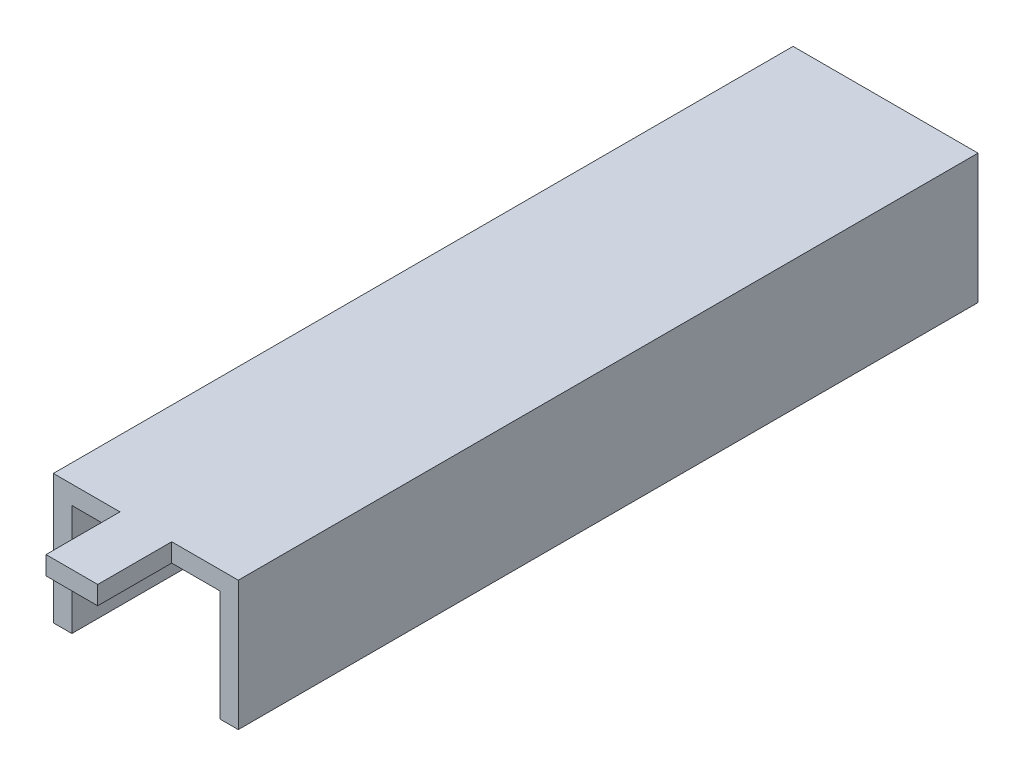
ISO-10303-21;
HEADER;
FILE_DESCRIPTION(('STEP AP214'),'2;1');
FILE_NAME('part.step','',(''),(''),'','','');
FILE_SCHEMA(('AUTOMOTIVE_DESIGN { 1 0 10303 214 1 1 1 1 }'));
ENDSEC;
DATA;
#1=APPLICATION_CONTEXT('core data for automotive mechanical design processes');
#2=APPLICATION_PROTOCOL_DEFINITION('international standard','automotive_design',2000,#1);
#3=PRODUCT_CONTEXT('',#1,'mechanical');
#4=PRODUCT('Part','Part','',(#3));
#5=PRODUCT_RELATED_PRODUCT_CATEGORY('part','',(#4));
#6=PRODUCT_DEFINITION_FORMATION('','',#4);
#7=PRODUCT_DEFINITION_CONTEXT('part definition',#1,'design');
#8=PRODUCT_DEFINITION('design','',#6,#7);
#9=PRODUCT_DEFINITION_SHAPE('','',#8);
#10=(LENGTH_UNIT() NAMED_UNIT(*) SI_UNIT(.MILLI.,.METRE.));
#11=(NAMED_UNIT(*) PLANE_ANGLE_UNIT() SI_UNIT($,.RADIAN.));
#12=(NAMED_UNIT(*) SI_UNIT($,.STERADIAN.) SOLID_ANGLE_UNIT());
#13=UNCERTAINTY_MEASURE_WITH_UNIT(LENGTH_MEASURE(1.E-05),#10,'distance_accuracy_value','');
#14=(GEOMETRIC_REPRESENTATION_CONTEXT(3) GLOBAL_UNCERTAINTY_ASSIGNED_CONTEXT((#13)) GLOBAL_UNIT_ASSIGNED_CONTEXT((#10,
#11,#12)) REPRESENTATION_CONTEXT('',''));
#15=CARTESIAN_POINT('',(0.,0.,0.));
#16=DIRECTION('',(0.,0.,1.));
#17=DIRECTION('',(1.,0.,0.));
#18=AXIS2_PLACEMENT_3D('',#15,#16,#17);
#19=CARTESIAN_POINT('',(0.,0.,254.));
#20=DIRECTION('',(0.,0.,-1.));
#21=DIRECTION('',(-1.,0.,0.));
#22=AXIS2_PLACEMENT_3D('',#19,#20,#21);
#23=PLANE('',#22);
#24=DIRECTION('',(0.,-1.,0.));
#25=VECTOR('',#24,1.);
#26=CARTESIAN_POINT('',(22.8703532456134,38.1,254.));
#27=LINE('',#26,#25);
#28=CARTESIAN_POINT('',(22.8703532456134,44.45,254.));
#29=VERTEX_POINT('',#28);
#30=CARTESIAN_POINT('',(22.8703532456134,38.1,254.));
#31=VERTEX_POINT('',#30);
#32=EDGE_CURVE('E49',#29,#31,#27,.T.);
#33=ORIENTED_EDGE('',*,*,#32,.F.);
#34=DIRECTION('',(-1.,0.,0.));
#35=VECTOR('',#34,1.);
#36=CARTESIAN_POINT('',(57.15,44.45,254.));
#37=LINE('',#36,#35);
#38=CARTESIAN_POINT('',(0.,44.45,254.));
#39=VERTEX_POINT('',#38);
#40=EDGE_CURVE('E171',#29,#39,#37,.T.);
#41=ORIENTED_EDGE('',*,*,#40,.T.);
#42=DIRECTION('',(0.,-1.,0.));
#43=VECTOR('',#42,1.);
#44=CARTESIAN_POINT('',(0.,0.,254.));
#45=LINE('',#44,#43);
#46=CARTESIAN_POINT('',(0.,0.,254.));
#47=VERTEX_POINT('',#46);
#48=EDGE_CURVE('E154',#39,#47,#45,.T.);
#49=ORIENTED_EDGE('',*,*,#48,.T.);
#50=DIRECTION('',(1.,0.,0.));
#51=VECTOR('',#50,1.);
#52=CARTESIAN_POINT('',(0.,0.,254.));
#53=LINE('',#52,#51);
#54=CARTESIAN_POINT('',(6.35,0.,254.));
#55=VERTEX_POINT('',#54);
#56=EDGE_CURVE('E157',#47,#55,#53,.T.);
#57=ORIENTED_EDGE('',*,*,#56,.T.);
#58=DIRECTION('',(0.,1.,0.));
#59=VECTOR('',#58,1.);
#60=CARTESIAN_POINT('',(6.35,0.,254.));
#61=LINE('',#60,#59);
#62=CARTESIAN_POINT('',(6.35,38.1,254.));
#63=VERTEX_POINT('',#62);
#64=EDGE_CURVE('E160',#55,#63,#61,.T.);
#65=ORIENTED_EDGE('',*,*,#64,.T.);
#66=DIRECTION('',(1.,0.,0.));
#67=VECTOR('',#66,1.);
#68=CARTESIAN_POINT('',(6.35,38.1,254.));
#69=LINE('',#68,#67);
#70=EDGE_CURVE('E163',#63,#31,#69,.T.);
#71=ORIENTED_EDGE('',*,*,#70,.T.);
#72=EDGE_LOOP('',(#33,#41,#49,#57,#65,#71));
#73=FACE_BOUND('',#72,.T.);
#74=ADVANCED_FACE('F34',(#73),#23,.F.);
#75=DIRECTION('',(0.,1.,0.));
#76=VECTOR('',#75,1.);
#77=CARTESIAN_POINT('',(40.6296467543866,38.1,254.));
#78=LINE('',#77,#76);
#79=CARTESIAN_POINT('',(40.6296467543866,38.1,254.));
#80=VERTEX_POINT('',#79);
#81=CARTESIAN_POINT('',(40.6296467543866,44.45,254.));
#82=VERTEX_POINT('',#81);
#83=EDGE_CURVE('E57',#80,#82,#78,.T.);
#84=ORIENTED_EDGE('',*,*,#83,.F.);
#85=CARTESIAN_POINT('',(57.15,38.1,254.));
#86=VERTEX_POINT('',#85);
#87=EDGE_CURVE('E162',#80,#86,#69,.T.);
#88=ORIENTED_EDGE('',*,*,#87,.T.);
#89=DIRECTION('',(0.,-1.,0.));
#90=VECTOR('',#89,1.);
#91=CARTESIAN_POINT('',(57.15,38.1,254.));
#92=LINE('',#91,#90);
#93=CARTESIAN_POINT('',(57.15,0.,254.));
#94=VERTEX_POINT('',#93);
#95=EDGE_CURVE('E165',#86,#94,#92,.T.);
#96=ORIENTED_EDGE('',*,*,#95,.T.);
#97=DIRECTION('',(1.,0.,0.));
#98=VECTOR('',#97,1.);
#99=CARTESIAN_POINT('',(57.15,0.,254.));
#100=LINE('',#99,#98);
#101=CARTESIAN_POINT('',(63.5,0.,254.));
#102=VERTEX_POINT('',#101);
#103=EDGE_CURVE('E167',#94,#102,#100,.T.);
#104=ORIENTED_EDGE('',*,*,#103,.T.);
#105=DIRECTION('',(0.,1.,0.));
#106=VECTOR('',#105,1.);
#107=CARTESIAN_POINT('',(63.5,44.45,254.));
#108=LINE('',#107,#106);
#109=CARTESIAN_POINT('',(63.5,44.45,254.));
#110=VERTEX_POINT('',#109);
#111=EDGE_CURVE('E169',#102,#110,#108,.T.);
#112=ORIENTED_EDGE('',*,*,#111,.T.);
#113=EDGE_CURVE('E172',#110,#82,#37,.T.);
#114=ORIENTED_EDGE('',*,*,#113,.T.);
#115=EDGE_LOOP('',(#84,#88,#96,#104,#112,#114));
#116=FACE_BOUND('',#115,.T.);
#117=ADVANCED_FACE('F224',(#116),#23,.F.);
#118=CARTESIAN_POINT('',(0.,0.,254.));
#119=DIRECTION('',(1.,0.,0.));
#120=DIRECTION('',(0.,0.,-1.));
#121=AXIS2_PLACEMENT_3D('',#118,#119,#120);
#122=PLANE('',#121);
#123=DIRECTION('',(0.,-1.,0.));
#124=VECTOR('',#123,1.);
#125=CARTESIAN_POINT('',(0.,0.,0.));
#126=LINE('',#125,#124);
#127=CARTESIAN_POINT('',(0.,44.45,0.));
#128=VERTEX_POINT('',#127);
#129=CARTESIAN_POINT('',(0.,0.,0.));
#130=VERTEX_POINT('',#129);
#131=EDGE_CURVE('E145',#128,#130,#126,.T.);
#132=ORIENTED_EDGE('',*,*,#131,.T.);
#133=DIRECTION('',(0.,0.,-1.));
#134=VECTOR('',#133,1.);
#135=CARTESIAN_POINT('',(0.,0.,254.));
#136=LINE('',#135,#134);
#137=EDGE_CURVE('E11',#47,#130,#136,.T.);
#138=ORIENTED_EDGE('',*,*,#137,.F.);
#139=ORIENTED_EDGE('',*,*,#48,.F.);
#140=DIRECTION('',(0.,0.,-1.));
#141=VECTOR('',#140,1.);
#142=CARTESIAN_POINT('',(0.,44.45,254.));
#143=LINE('',#142,#141);
#144=EDGE_CURVE('E173',#39,#128,#143,.T.);
#145=ORIENTED_EDGE('',*,*,#144,.T.);
#146=EDGE_LOOP('',(#132,#138,#139,#145));
#147=FACE_BOUND('',#146,.T.);
#148=ADVANCED_FACE('F36',(#147),#122,.F.);
#149=CARTESIAN_POINT('',(0.,0.,254.));
#150=DIRECTION('',(0.,1.,0.));
#151=DIRECTION('',(0.,0.,1.));
#152=AXIS2_PLACEMENT_3D('',#149,#150,#151);
#153=PLANE('',#152);
#154=DIRECTION('',(1.,0.,0.));
#155=VECTOR('',#154,1.);
#156=CARTESIAN_POINT('',(0.,0.,0.));
#157=LINE('',#156,#155);
#158=CARTESIAN_POINT('',(6.35,0.,0.));
#159=VERTEX_POINT('',#158);
#160=EDGE_CURVE('E148',#130,#159,#157,.T.);
#161=ORIENTED_EDGE('',*,*,#160,.T.);
#162=DIRECTION('',(0.,0.,-1.));
#163=VECTOR('',#162,1.);
#164=CARTESIAN_POINT('',(6.35,0.,254.));
#165=LINE('',#164,#163);
#166=EDGE_CURVE('E42',#55,#159,#165,.T.);
#167=ORIENTED_EDGE('',*,*,#166,.F.);
#168=ORIENTED_EDGE('',*,*,#56,.F.);
#169=ORIENTED_EDGE('',*,*,#137,.T.);
#170=EDGE_LOOP('',(#161,#167,#168,#169));
#171=FACE_BOUND('',#170,.T.);
#172=ADVANCED_FACE('F243',(#171),#153,.F.);
#173=CARTESIAN_POINT('',(6.35,0.,254.));
#174=DIRECTION('',(-1.,0.,0.));
#175=DIRECTION('',(0.,-1.,0.));
#176=AXIS2_PLACEMENT_3D('',#173,#174,#175);
#177=PLANE('',#176);
#178=DIRECTION('',(0.,1.,0.));
#179=VECTOR('',#178,1.);
#180=CARTESIAN_POINT('',(6.35,0.,0.));
#181=LINE('',#180,#179);
#182=CARTESIAN_POINT('',(6.35,38.1,0.));
#183=VERTEX_POINT('',#182);
#184=EDGE_CURVE('E176',#159,#183,#181,.T.);
#185=ORIENTED_EDGE('',*,*,#184,.T.);
#186=DIRECTION('',(0.,0.,-1.));
#187=VECTOR('',#186,1.);
#188=CARTESIAN_POINT('',(6.35,38.1,254.));
#189=LINE('',#188,#187);
#190=EDGE_CURVE('E202',#63,#183,#189,.T.);
#191=ORIENTED_EDGE('',*,*,#190,.F.);
#192=ORIENTED_EDGE('',*,*,#64,.F.);
#193=ORIENTED_EDGE('',*,*,#166,.T.);
#194=EDGE_LOOP('',(#185,#191,#192,#193));
#195=FACE_BOUND('',#194,.T.);
#196=ADVANCED_FACE('F209',(#195),#177,.F.);
#197=CARTESIAN_POINT('',(6.35,38.1,254.));
#198=DIRECTION('',(0.,1.,0.));
#199=DIRECTION('',(0.,0.,1.));
#200=AXIS2_PLACEMENT_3D('',#197,#198,#199);
#201=PLANE('',#200);
#202=DIRECTION('',(1.,0.,0.));
#203=VECTOR('',#202,1.);
#204=CARTESIAN_POINT('',(6.35,38.1,0.));
#205=LINE('',#204,#203);
#206=CARTESIAN_POINT('',(57.15,38.1,0.));
#207=VERTEX_POINT('',#206);
#208=EDGE_CURVE('E178',#183,#207,#205,.T.);
#209=ORIENTED_EDGE('',*,*,#208,.T.);
#210=DIRECTION('',(0.,0.,-1.));
#211=VECTOR('',#210,1.);
#212=CARTESIAN_POINT('',(57.15,38.1,254.));
#213=LINE('',#212,#211);
#214=EDGE_CURVE('E199',#86,#207,#213,.T.);
#215=ORIENTED_EDGE('',*,*,#214,.F.);
#216=ORIENTED_EDGE('',*,*,#87,.F.);
#217=DIRECTION('',(0.,0.,-1.));
#218=VECTOR('',#217,1.);
#219=CARTESIAN_POINT('',(40.6296467543866,38.1,279.4));
#220=LINE('',#219,#218);
#221=CARTESIAN_POINT('',(40.6296467543866,38.1,279.4));
#222=VERTEX_POINT('',#221);
#223=EDGE_CURVE('E130',#222,#80,#220,.T.);
#224=ORIENTED_EDGE('',*,*,#223,.F.);
#225=DIRECTION('',(1.,0.,0.));
#226=VECTOR('',#225,1.);
#227=CARTESIAN_POINT('',(22.8703532456134,38.1,279.4));
#228=LINE('',#227,#226);
#229=CARTESIAN_POINT('',(22.8703532456134,38.1,279.4));
#230=VERTEX_POINT('',#229);
#231=EDGE_CURVE('E123',#230,#222,#228,.T.);
#232=ORIENTED_EDGE('',*,*,#231,.F.);
#233=DIRECTION('',(0.,0.,-1.));
#234=VECTOR('',#233,1.);
#235=CARTESIAN_POINT('',(22.8703532456134,38.1,279.4));
#236=LINE('',#235,#234);
#237=EDGE_CURVE('E128',#230,#31,#236,.T.);
#238=ORIENTED_EDGE('',*,*,#237,.T.);
#239=ORIENTED_EDGE('',*,*,#70,.F.);
#240=ORIENTED_EDGE('',*,*,#190,.T.);
#241=EDGE_LOOP('',(#209,#215,#216,#224,#232,#238,#239,#240));
#242=FACE_BOUND('',#241,.T.);
#243=ADVANCED_FACE('F125',(#242),#201,.F.);
#244=CARTESIAN_POINT('',(57.15,38.1,254.));
#245=DIRECTION('',(1.,0.,0.));
#246=DIRECTION('',(0.,1.,0.));
#247=AXIS2_PLACEMENT_3D('',#244,#245,#246);
#248=PLANE('',#247);
#249=DIRECTION('',(0.,-1.,0.));
#250=VECTOR('',#249,1.);
#251=CARTESIAN_POINT('',(57.15,38.1,0.));
#252=LINE('',#251,#250);
#253=CARTESIAN_POINT('',(57.15,0.,0.));
#254=VERTEX_POINT('',#253);
#255=EDGE_CURVE('E180',#207,#254,#252,.T.);
#256=ORIENTED_EDGE('',*,*,#255,.T.);
#257=DIRECTION('',(0.,0.,-1.));
#258=VECTOR('',#257,1.);
#259=CARTESIAN_POINT('',(57.15,0.,254.));
#260=LINE('',#259,#258);
#261=EDGE_CURVE('E196',#94,#254,#260,.T.);
#262=ORIENTED_EDGE('',*,*,#261,.F.);
#263=ORIENTED_EDGE('',*,*,#95,.F.);
#264=ORIENTED_EDGE('',*,*,#214,.T.);
#265=EDGE_LOOP('',(#256,#262,#263,#264));
#266=FACE_BOUND('',#265,.T.);
#267=ADVANCED_FACE('F221',(#266),#248,.F.);
#268=CARTESIAN_POINT('',(57.15,0.,254.));
#269=DIRECTION('',(0.,1.,0.));
#270=DIRECTION('',(-1.,0.,0.));
#271=AXIS2_PLACEMENT_3D('',#268,#269,#270);
#272=PLANE('',#271);
#273=DIRECTION('',(1.,0.,0.));
#274=VECTOR('',#273,1.);
#275=CARTESIAN_POINT('',(57.15,0.,0.));
#276=LINE('',#275,#274);
#277=CARTESIAN_POINT('',(63.5,0.,0.));
#278=VERTEX_POINT('',#277);
#279=EDGE_CURVE('E182',#254,#278,#276,.T.);
#280=ORIENTED_EDGE('',*,*,#279,.T.);
#281=DIRECTION('',(0.,0.,-1.));
#282=VECTOR('',#281,1.);
#283=CARTESIAN_POINT('',(63.5,0.,254.));
#284=LINE('',#283,#282);
#285=EDGE_CURVE('E193',#102,#278,#284,.T.);
#286=ORIENTED_EDGE('',*,*,#285,.F.);
#287=ORIENTED_EDGE('',*,*,#103,.F.);
#288=ORIENTED_EDGE('',*,*,#261,.T.);
#289=EDGE_LOOP('',(#280,#286,#287,#288));
#290=FACE_BOUND('',#289,.T.);
#291=ADVANCED_FACE('F265',(#290),#272,.F.);
#292=CARTESIAN_POINT('',(63.5,44.45,254.));
#293=DIRECTION('',(-1.,0.,0.));
#294=DIRECTION('',(0.,0.,1.));
#295=AXIS2_PLACEMENT_3D('',#292,#293,#294);
#296=PLANE('',#295);
#297=DIRECTION('',(0.,1.,0.));
#298=VECTOR('',#297,1.);
#299=CARTESIAN_POINT('',(63.5,44.45,0.));
#300=LINE('',#299,#298);
#301=CARTESIAN_POINT('',(63.5,44.45,0.));
#302=VERTEX_POINT('',#301);
#303=EDGE_CURVE('E184',#278,#302,#300,.T.);
#304=ORIENTED_EDGE('',*,*,#303,.T.);
#305=DIRECTION('',(0.,0.,-1.));
#306=VECTOR('',#305,1.);
#307=CARTESIAN_POINT('',(63.5,44.45,254.));
#308=LINE('',#307,#306);
#309=EDGE_CURVE('E190',#110,#302,#308,.T.);
#310=ORIENTED_EDGE('',*,*,#309,.F.);
#311=ORIENTED_EDGE('',*,*,#111,.F.);
#312=ORIENTED_EDGE('',*,*,#285,.T.);
#313=EDGE_LOOP('',(#304,#310,#311,#312));
#314=FACE_BOUND('',#313,.T.);
#315=ADVANCED_FACE('F262',(#314),#296,.F.);
#316=CARTESIAN_POINT('',(0.,44.45,254.));
#317=DIRECTION('',(0.,-1.,0.));
#318=DIRECTION('',(0.,0.,-1.));
#319=AXIS2_PLACEMENT_3D('',#316,#317,#318);
#320=PLANE('',#319);
#321=DIRECTION('',(-1.,0.,0.));
#322=VECTOR('',#321,1.);
#323=CARTESIAN_POINT('',(0.,44.45,0.));
#324=LINE('',#323,#322);
#325=EDGE_CURVE('E158',#302,#128,#324,.T.);
#326=ORIENTED_EDGE('',*,*,#325,.T.);
#327=ORIENTED_EDGE('',*,*,#144,.F.);
#328=ORIENTED_EDGE('',*,*,#40,.F.);
#329=DIRECTION('',(0.,0.,-1.));
#330=VECTOR('',#329,1.);
#331=CARTESIAN_POINT('',(22.8703532456134,44.45,279.4));
#332=LINE('',#331,#330);
#333=CARTESIAN_POINT('',(22.8703532456134,44.45,279.4));
#334=VERTEX_POINT('',#333);
#335=EDGE_CURVE('E231',#334,#29,#332,.T.);
#336=ORIENTED_EDGE('',*,*,#335,.F.);
#337=DIRECTION('',(-1.,0.,0.));
#338=VECTOR('',#337,1.);
#339=CARTESIAN_POINT('',(22.8703532456134,44.45,279.4));
#340=LINE('',#339,#338);
#341=CARTESIAN_POINT('',(40.6296467543866,44.45,279.4));
#342=VERTEX_POINT('',#341);
#343=EDGE_CURVE('E139',#342,#334,#340,.T.);
#344=ORIENTED_EDGE('',*,*,#343,.F.);
#345=DIRECTION('',(0.,0.,-1.));
#346=VECTOR('',#345,1.);
#347=CARTESIAN_POINT('',(40.6296467543866,44.45,279.4));
#348=LINE('',#347,#346);
#349=EDGE_CURVE('E150',#342,#82,#348,.T.);
#350=ORIENTED_EDGE('',*,*,#349,.T.);
#351=ORIENTED_EDGE('',*,*,#113,.F.);
#352=ORIENTED_EDGE('',*,*,#309,.T.);
#353=EDGE_LOOP('',(#326,#327,#328,#336,#344,#350,#351,#352));
#354=FACE_BOUND('',#353,.T.);
#355=ADVANCED_FACE('F238',(#354),#320,.F.);
#356=CARTESIAN_POINT('',(0.,0.,0.));
#357=DIRECTION('',(0.,0.,-1.));
#358=DIRECTION('',(-1.,0.,0.));
#359=AXIS2_PLACEMENT_3D('',#356,#357,#358);
#360=PLANE('',#359);
#361=ORIENTED_EDGE('',*,*,#131,.F.);
#362=ORIENTED_EDGE('',*,*,#325,.F.);
#363=ORIENTED_EDGE('',*,*,#303,.F.);
#364=ORIENTED_EDGE('',*,*,#279,.F.);
#365=ORIENTED_EDGE('',*,*,#255,.F.);
#366=ORIENTED_EDGE('',*,*,#208,.F.);
#367=ORIENTED_EDGE('',*,*,#184,.F.);
#368=ORIENTED_EDGE('',*,*,#160,.F.);
#369=EDGE_LOOP('',(#361,#362,#363,#364,#365,#366,#367,#368));
#370=FACE_BOUND('',#369,.T.);
#371=ADVANCED_FACE('F215',(#370),#360,.T.);
#372=CARTESIAN_POINT('',(22.8703532456134,38.1,279.4));
#373=DIRECTION('',(1.,0.,0.));
#374=DIRECTION('',(0.,0.,-1.));
#375=AXIS2_PLACEMENT_3D('',#372,#373,#374);
#376=PLANE('',#375);
#377=ORIENTED_EDGE('',*,*,#32,.T.);
#378=ORIENTED_EDGE('',*,*,#237,.F.);
#379=DIRECTION('',(0.,-1.,0.));
#380=VECTOR('',#379,1.);
#381=CARTESIAN_POINT('',(22.8703532456134,38.1,279.4));
#382=LINE('',#381,#380);
#383=EDGE_CURVE('E134',#334,#230,#382,.T.);
#384=ORIENTED_EDGE('',*,*,#383,.F.);
#385=ORIENTED_EDGE('',*,*,#335,.T.);
#386=EDGE_LOOP('',(#377,#378,#384,#385));
#387=FACE_BOUND('',#386,.T.);
#388=ADVANCED_FACE('F144',(#387),#376,.F.);
#389=CARTESIAN_POINT('',(40.6296467543866,38.1,279.4));
#390=DIRECTION('',(-1.,0.,0.));
#391=DIRECTION('',(0.,0.,1.));
#392=AXIS2_PLACEMENT_3D('',#389,#390,#391);
#393=PLANE('',#392);
#394=ORIENTED_EDGE('',*,*,#83,.T.);
#395=ORIENTED_EDGE('',*,*,#349,.F.);
#396=DIRECTION('',(0.,1.,0.));
#397=VECTOR('',#396,1.);
#398=CARTESIAN_POINT('',(40.6296467543866,38.1,279.4));
#399=LINE('',#398,#397);
#400=EDGE_CURVE('E133',#222,#342,#399,.T.);
#401=ORIENTED_EDGE('',*,*,#400,.F.);
#402=ORIENTED_EDGE('',*,*,#223,.T.);
#403=EDGE_LOOP('',(#394,#395,#401,#402));
#404=FACE_BOUND('',#403,.T.);
#405=ADVANCED_FACE('F227',(#404),#393,.F.);
#406=CARTESIAN_POINT('',(0.,0.,279.4));
#407=DIRECTION('',(0.,0.,-1.));
#408=DIRECTION('',(-1.,0.,0.));
#409=AXIS2_PLACEMENT_3D('',#406,#407,#408);
#410=PLANE('',#409);
#411=ORIENTED_EDGE('',*,*,#383,.T.);
#412=ORIENTED_EDGE('',*,*,#231,.T.);
#413=ORIENTED_EDGE('',*,*,#400,.T.);
#414=ORIENTED_EDGE('',*,*,#343,.T.);
#415=EDGE_LOOP('',(#411,#412,#413,#414));
#416=FACE_BOUND('',#415,.T.);
#417=ADVANCED_FACE('F137',(#416),#410,.F.);
#418=CLOSED_SHELL('',(#74,#117,#148,#172,#196,#243,#267,#291,#315,#355,#371,#388,#405,#417));
#419=MANIFOLD_SOLID_BREP('B2',#418);
#420=ADVANCED_BREP_SHAPE_REPRESENTATION('',(#18,#419),#14);
#421=SHAPE_DEFINITION_REPRESENTATION(#9,#420);
ENDSEC;
END-ISO-10303-21;
